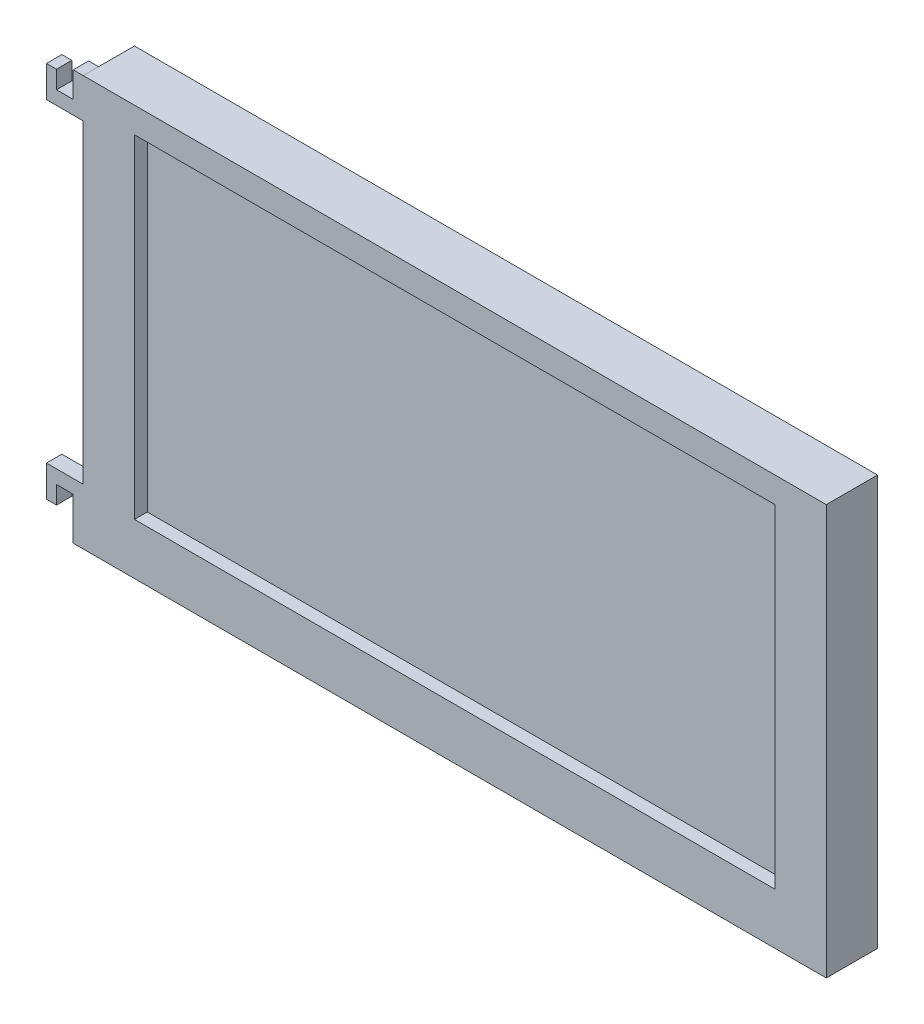
ISO-10303-21;
HEADER;
FILE_DESCRIPTION(('STEP AP214'),'2;1');
FILE_NAME('part.step','',(''),(''),'','','');
FILE_SCHEMA(('AUTOMOTIVE_DESIGN { 1 0 10303 214 1 1 1 1 }'));
ENDSEC;
DATA;
#1=APPLICATION_CONTEXT('core data for automotive mechanical design processes');
#2=APPLICATION_PROTOCOL_DEFINITION('international standard','automotive_design',2000,#1);
#3=PRODUCT_CONTEXT('',#1,'mechanical');
#4=PRODUCT('Part','Part','',(#3));
#5=PRODUCT_RELATED_PRODUCT_CATEGORY('part','',(#4));
#6=PRODUCT_DEFINITION_FORMATION('','',#4);
#7=PRODUCT_DEFINITION_CONTEXT('part definition',#1,'design');
#8=PRODUCT_DEFINITION('design','',#6,#7);
#9=PRODUCT_DEFINITION_SHAPE('','',#8);
#10=(LENGTH_UNIT() NAMED_UNIT(*) SI_UNIT(.MILLI.,.METRE.));
#11=(NAMED_UNIT(*) PLANE_ANGLE_UNIT() SI_UNIT($,.RADIAN.));
#12=(NAMED_UNIT(*) SI_UNIT($,.STERADIAN.) SOLID_ANGLE_UNIT());
#13=UNCERTAINTY_MEASURE_WITH_UNIT(LENGTH_MEASURE(1.E-05),#10,'distance_accuracy_value','');
#14=(GEOMETRIC_REPRESENTATION_CONTEXT(3) GLOBAL_UNCERTAINTY_ASSIGNED_CONTEXT((#13)) GLOBAL_UNIT_ASSIGNED_CONTEXT((#10,
#11,#12)) REPRESENTATION_CONTEXT('',''));
#15=CARTESIAN_POINT('',(0.,0.,0.));
#16=DIRECTION('',(0.,0.,1.));
#17=DIRECTION('',(1.,0.,0.));
#18=AXIS2_PLACEMENT_3D('',#15,#16,#17);
#19=CARTESIAN_POINT('',(0.,0.,12.7));
#20=DIRECTION('',(0.,0.,1.));
#21=DIRECTION('',(1.,0.,0.));
#22=AXIS2_PLACEMENT_3D('',#19,#20,#21);
#23=PLANE('',#22);
#24=DIRECTION('',(1.,0.,0.));
#25=VECTOR('',#24,1.);
#26=CARTESIAN_POINT('',(-184.15,-101.6,12.7));
#27=LINE('',#26,#25);
#28=CARTESIAN_POINT('',(-189.1197006928,-101.6,12.7));
#29=VERTEX_POINT('',#28);
#30=CARTESIAN_POINT('',(184.15,-101.6,12.7));
#31=VERTEX_POINT('',#30);
#32=EDGE_CURVE('E205',#29,#31,#27,.T.);
#33=ORIENTED_EDGE('',*,*,#32,.T.);
#34=DIRECTION('',(0.,1.,0.));
#35=VECTOR('',#34,1.);
#36=CARTESIAN_POINT('',(184.15,101.6,12.7));
#37=LINE('',#36,#35);
#38=CARTESIAN_POINT('',(184.15,101.6,12.7));
#39=VERTEX_POINT('',#38);
#40=EDGE_CURVE('E195',#31,#39,#37,.T.);
#41=ORIENTED_EDGE('',*,*,#40,.T.);
#42=DIRECTION('',(-1.,0.,0.));
#43=VECTOR('',#42,1.);
#44=CARTESIAN_POINT('',(-184.15,101.6,12.7));
#45=LINE('',#44,#43);
#46=CARTESIAN_POINT('',(-184.15,101.6,12.7));
#47=VERTEX_POINT('',#46);
#48=EDGE_CURVE('E204',#39,#47,#45,.T.);
#49=ORIENTED_EDGE('',*,*,#48,.T.);
#50=DIRECTION('',(0.,-1.,0.));
#51=VECTOR('',#50,1.);
#52=CARTESIAN_POINT('',(-184.15,101.6,12.7));
#53=LINE('',#52,#51);
#54=CARTESIAN_POINT('',(-184.15,101.584884773139,12.7));
#55=VERTEX_POINT('',#54);
#56=EDGE_CURVE('E220',#47,#55,#53,.T.);
#57=ORIENTED_EDGE('',*,*,#56,.T.);
#58=DIRECTION('',(1.,0.,0.));
#59=VECTOR('',#58,1.);
#60=CARTESIAN_POINT('',(-184.15,101.584884773139,12.7));
#61=LINE('',#60,#59);
#62=CARTESIAN_POINT('',(-189.1197006928,101.584884773139,12.7));
#63=VERTEX_POINT('',#62);
#64=EDGE_CURVE('E265',#63,#55,#61,.T.);
#65=ORIENTED_EDGE('',*,*,#64,.F.);
#66=DIRECTION('',(0.,1.,0.));
#67=VECTOR('',#66,1.);
#68=CARTESIAN_POINT('',(-189.1197006928,88.9,12.7));
#69=LINE('',#68,#67);
#70=CARTESIAN_POINT('',(-189.1197006928,88.9,12.7));
#71=VERTEX_POINT('',#70);
#72=EDGE_CURVE('E267',#71,#63,#69,.T.);
#73=ORIENTED_EDGE('',*,*,#72,.F.);
#74=DIRECTION('',(1.,0.,0.));
#75=VECTOR('',#74,1.);
#76=CARTESIAN_POINT('',(-189.1197006928,88.9,12.7));
#77=LINE('',#76,#75);
#78=CARTESIAN_POINT('',(-197.392455233142,88.9,12.7));
#79=VERTEX_POINT('',#78);
#80=EDGE_CURVE('E273',#79,#71,#77,.T.);
#81=ORIENTED_EDGE('',*,*,#80,.F.);
#82=DIRECTION('',(0.,-1.,0.));
#83=VECTOR('',#82,1.);
#84=CARTESIAN_POINT('',(-197.392455233142,88.9,12.7));
#85=LINE('',#84,#83);
#86=CARTESIAN_POINT('',(-197.392455233142,97.7096777511746,12.7));
#87=VERTEX_POINT('',#86);
#88=EDGE_CURVE('E281',#87,#79,#85,.T.);
#89=ORIENTED_EDGE('',*,*,#88,.F.);
#90=DIRECTION('',(1.,0.,0.));
#91=VECTOR('',#90,1.);
#92=CARTESIAN_POINT('',(-197.392455233142,97.7096777511746,12.7));
#93=LINE('',#92,#91);
#94=CARTESIAN_POINT('',(-202.362155925942,97.7096777511746,12.7));
#95=VERTEX_POINT('',#94);
#96=EDGE_CURVE('E284',#95,#87,#93,.T.);
#97=ORIENTED_EDGE('',*,*,#96,.F.);
#98=DIRECTION('',(0.,1.,0.));
#99=VECTOR('',#98,1.);
#100=CARTESIAN_POINT('',(-202.362155925942,82.1604398677149,12.7));
#101=LINE('',#100,#99);
#102=CARTESIAN_POINT('',(-202.362155925942,82.1604398677149,12.7));
#103=VERTEX_POINT('',#102);
#104=EDGE_CURVE('E287',#103,#95,#101,.T.);
#105=ORIENTED_EDGE('',*,*,#104,.F.);
#106=DIRECTION('',(-1.,0.,0.));
#107=VECTOR('',#106,1.);
#108=CARTESIAN_POINT('',(-184.15,82.1604398677149,12.7));
#109=LINE('',#108,#107);
#110=CARTESIAN_POINT('',(-184.15,82.1604398677149,12.7));
#111=VERTEX_POINT('',#110);
#112=EDGE_CURVE('E57',#111,#103,#109,.T.);
#113=ORIENTED_EDGE('',*,*,#112,.F.);
#114=CARTESIAN_POINT('',(-184.15,-73.8206556166965,12.7));
#115=VERTEX_POINT('',#114);
#116=EDGE_CURVE('E62',#111,#115,#53,.T.);
#117=ORIENTED_EDGE('',*,*,#116,.T.);
#118=DIRECTION('',(1.,0.,0.));
#119=VECTOR('',#118,1.);
#120=CARTESIAN_POINT('',(-184.15,-73.8206556166965,12.7));
#121=LINE('',#120,#119);
#122=CARTESIAN_POINT('',(-202.362155925942,-73.8206556166965,12.7));
#123=VERTEX_POINT('',#122);
#124=EDGE_CURVE('E296',#123,#115,#121,.T.);
#125=ORIENTED_EDGE('',*,*,#124,.F.);
#126=DIRECTION('',(0.,1.,0.));
#127=VECTOR('',#126,1.);
#128=CARTESIAN_POINT('',(-202.362155925942,-73.8206556166965,12.7));
#129=LINE('',#128,#127);
#130=CARTESIAN_POINT('',(-202.362155925942,-89.3698935001561,12.7));
#131=VERTEX_POINT('',#130);
#132=EDGE_CURVE('E350',#131,#123,#129,.T.);
#133=ORIENTED_EDGE('',*,*,#132,.F.);
#134=DIRECTION('',(-1.,0.,0.));
#135=VECTOR('',#134,1.);
#136=CARTESIAN_POINT('',(-202.362155925942,-89.3698935001561,12.7));
#137=LINE('',#136,#135);
#138=CARTESIAN_POINT('',(-197.392455233142,-89.3698935001561,12.7));
#139=VERTEX_POINT('',#138);
#140=EDGE_CURVE('E353',#139,#131,#137,.T.);
#141=ORIENTED_EDGE('',*,*,#140,.F.);
#142=DIRECTION('',(0.,-1.,0.));
#143=VECTOR('',#142,1.);
#144=CARTESIAN_POINT('',(-197.392455233142,-80.5602157489815,12.7));
#145=LINE('',#144,#143);
#146=CARTESIAN_POINT('',(-197.392455233142,-80.5602157489815,12.7));
#147=VERTEX_POINT('',#146);
#148=EDGE_CURVE('E356',#147,#139,#145,.T.);
#149=ORIENTED_EDGE('',*,*,#148,.F.);
#150=DIRECTION('',(-1.,0.,0.));
#151=VECTOR('',#150,1.);
#152=CARTESIAN_POINT('',(-189.1197006928,-80.5602157489815,12.7));
#153=LINE('',#152,#151);
#154=CARTESIAN_POINT('',(-189.1197006928,-80.5602157489815,12.7));
#155=VERTEX_POINT('',#154);
#156=EDGE_CURVE('E359',#155,#147,#153,.T.);
#157=ORIENTED_EDGE('',*,*,#156,.F.);
#158=DIRECTION('',(0.,1.,0.));
#159=VECTOR('',#158,1.);
#160=CARTESIAN_POINT('',(-189.1197006928,-101.6,12.7));
#161=LINE('',#160,#159);
#162=EDGE_CURVE('E218',#29,#155,#161,.T.);
#163=ORIENTED_EDGE('',*,*,#162,.F.);
#164=EDGE_LOOP('',(#33,#41,#49,#57,#65,#73,#81,#89,#97,#105,#113,#117,#125,#133,#141,#149,#157,#163));
#165=FACE_BOUND('',#164,.T.);
#166=DIRECTION('',(0.,-1.,0.));
#167=VECTOR('',#166,1.);
#168=CARTESIAN_POINT('',(-158.75,88.9,12.7));
#169=LINE('',#168,#167);
#170=CARTESIAN_POINT('',(-158.75,88.9,12.7));
#171=VERTEX_POINT('',#170);
#172=CARTESIAN_POINT('',(-158.75,-76.2,12.7));
#173=VERTEX_POINT('',#172);
#174=EDGE_CURVE('E367',#171,#173,#169,.T.);
#175=ORIENTED_EDGE('',*,*,#174,.F.);
#176=DIRECTION('',(-1.,0.,0.));
#177=VECTOR('',#176,1.);
#178=CARTESIAN_POINT('',(-158.75,88.9,12.7));
#179=LINE('',#178,#177);
#180=CARTESIAN_POINT('',(158.75,88.9,12.7));
#181=VERTEX_POINT('',#180);
#182=EDGE_CURVE('E396',#181,#171,#179,.T.);
#183=ORIENTED_EDGE('',*,*,#182,.F.);
#184=DIRECTION('',(0.,1.,0.));
#185=VECTOR('',#184,1.);
#186=CARTESIAN_POINT('',(158.75,88.9,12.7));
#187=LINE('',#186,#185);
#188=CARTESIAN_POINT('',(158.75,-76.2,12.7));
#189=VERTEX_POINT('',#188);
#190=EDGE_CURVE('E415',#189,#181,#187,.T.);
#191=ORIENTED_EDGE('',*,*,#190,.F.);
#192=DIRECTION('',(1.,0.,0.));
#193=VECTOR('',#192,1.);
#194=CARTESIAN_POINT('',(-158.75,-76.2,12.7));
#195=LINE('',#194,#193);
#196=EDGE_CURVE('E411',#173,#189,#195,.T.);
#197=ORIENTED_EDGE('',*,*,#196,.F.);
#198=EDGE_LOOP('',(#175,#183,#191,#197));
#199=FACE_BOUND('',#198,.T.);
#200=ADVANCED_FACE('F41',(#165,#199),#23,.T.);
#201=CARTESIAN_POINT('',(-184.15,101.6,12.7));
#202=DIRECTION('',(1.,0.,0.));
#203=DIRECTION('',(0.,0.,-1.));
#204=AXIS2_PLACEMENT_3D('',#201,#202,#203);
#205=PLANE('',#204);
#206=DIRECTION('',(0.,0.,1.));
#207=VECTOR('',#206,1.);
#208=CARTESIAN_POINT('',(-184.15,82.1604398677149,5.08));
#209=LINE('',#208,#207);
#210=CARTESIAN_POINT('',(-184.15,82.1604398677149,5.08));
#211=VERTEX_POINT('',#210);
#212=EDGE_CURVE('E293',#211,#111,#209,.T.);
#213=ORIENTED_EDGE('',*,*,#212,.F.);
#214=DIRECTION('',(0.,-1.,0.));
#215=VECTOR('',#214,1.);
#216=CARTESIAN_POINT('',(-184.15,88.0125906923723,5.08));
#217=LINE('',#216,#215);
#218=CARTESIAN_POINT('',(-184.15,101.584884773139,5.08));
#219=VERTEX_POINT('',#218);
#220=EDGE_CURVE('E292',#219,#211,#217,.T.);
#221=ORIENTED_EDGE('',*,*,#220,.F.);
#222=DIRECTION('',(0.,0.,1.));
#223=VECTOR('',#222,1.);
#224=CARTESIAN_POINT('',(-184.15,101.584884773139,5.08));
#225=LINE('',#224,#223);
#226=EDGE_CURVE('E262',#219,#55,#225,.T.);
#227=ORIENTED_EDGE('',*,*,#226,.T.);
#228=ORIENTED_EDGE('',*,*,#56,.F.);
#229=DIRECTION('',(0.,0.,-1.));
#230=VECTOR('',#229,1.);
#231=CARTESIAN_POINT('',(-184.15,101.6,12.7));
#232=LINE('',#231,#230);
#233=CARTESIAN_POINT('',(-184.15,101.6,-12.7));
#234=VERTEX_POINT('',#233);
#235=EDGE_CURVE('E229',#47,#234,#232,.T.);
#236=ORIENTED_EDGE('',*,*,#235,.T.);
#237=DIRECTION('',(0.,-1.,0.));
#238=VECTOR('',#237,1.);
#239=CARTESIAN_POINT('',(-184.15,101.6,-12.7));
#240=LINE('',#239,#238);
#241=CARTESIAN_POINT('',(-184.15,-101.6,-12.7));
#242=VERTEX_POINT('',#241);
#243=EDGE_CURVE('E230',#234,#242,#240,.T.);
#244=ORIENTED_EDGE('',*,*,#243,.T.);
#245=DIRECTION('',(0.,0.,-1.));
#246=VECTOR('',#245,1.);
#247=CARTESIAN_POINT('',(-184.15,-101.6,12.7));
#248=LINE('',#247,#246);
#249=CARTESIAN_POINT('',(-184.15,-101.6,5.08));
#250=VERTEX_POINT('',#249);
#251=EDGE_CURVE('E11',#250,#242,#248,.T.);
#252=ORIENTED_EDGE('',*,*,#251,.F.);
#253=DIRECTION('',(0.,-1.,0.));
#254=VECTOR('',#253,1.);
#255=CARTESIAN_POINT('',(-184.15,-101.6,5.08));
#256=LINE('',#255,#254);
#257=CARTESIAN_POINT('',(-184.15,-73.8206556166965,5.08));
#258=VERTEX_POINT('',#257);
#259=EDGE_CURVE('E322',#258,#250,#256,.T.);
#260=ORIENTED_EDGE('',*,*,#259,.F.);
#261=DIRECTION('',(0.,0.,1.));
#262=VECTOR('',#261,1.);
#263=CARTESIAN_POINT('',(-184.15,-73.8206556166965,5.08));
#264=LINE('',#263,#262);
#265=EDGE_CURVE('E347',#258,#115,#264,.T.);
#266=ORIENTED_EDGE('',*,*,#265,.T.);
#267=ORIENTED_EDGE('',*,*,#116,.F.);
#268=EDGE_LOOP('',(#213,#221,#227,#228,#236,#244,#252,#260,#266,#267));
#269=FACE_BOUND('',#268,.T.);
#270=ADVANCED_FACE('F43',(#269),#205,.F.);
#271=CARTESIAN_POINT('',(184.15,101.6,12.7));
#272=DIRECTION('',(-1.,0.,0.));
#273=DIRECTION('',(0.,0.,1.));
#274=AXIS2_PLACEMENT_3D('',#271,#272,#273);
#275=PLANE('',#274);
#276=DIRECTION('',(0.,0.,-1.));
#277=VECTOR('',#276,1.);
#278=CARTESIAN_POINT('',(184.15,101.6,12.7));
#279=LINE('',#278,#277);
#280=CARTESIAN_POINT('',(184.15,101.6,-12.7));
#281=VERTEX_POINT('',#280);
#282=EDGE_CURVE('E200',#39,#281,#279,.T.);
#283=ORIENTED_EDGE('',*,*,#282,.F.);
#284=ORIENTED_EDGE('',*,*,#40,.F.);
#285=DIRECTION('',(0.,0.,-1.));
#286=VECTOR('',#285,1.);
#287=CARTESIAN_POINT('',(184.15,-101.6,12.7));
#288=LINE('',#287,#286);
#289=CARTESIAN_POINT('',(184.15,-101.6,-12.7));
#290=VERTEX_POINT('',#289);
#291=EDGE_CURVE('E50',#31,#290,#288,.T.);
#292=ORIENTED_EDGE('',*,*,#291,.T.);
#293=DIRECTION('',(0.,1.,0.));
#294=VECTOR('',#293,1.);
#295=CARTESIAN_POINT('',(184.15,101.6,-12.7));
#296=LINE('',#295,#294);
#297=EDGE_CURVE('E237',#290,#281,#296,.T.);
#298=ORIENTED_EDGE('',*,*,#297,.T.);
#299=EDGE_LOOP('',(#283,#284,#292,#298));
#300=FACE_BOUND('',#299,.T.);
#301=ADVANCED_FACE('F197',(#300),#275,.F.);
#302=CARTESIAN_POINT('',(-184.15,-101.6,12.7));
#303=DIRECTION('',(0.,1.,0.));
#304=DIRECTION('',(0.,0.,1.));
#305=AXIS2_PLACEMENT_3D('',#302,#303,#304);
#306=PLANE('',#305);
#307=ORIENTED_EDGE('',*,*,#291,.F.);
#308=ORIENTED_EDGE('',*,*,#32,.F.);
#309=DIRECTION('',(0.,0.,1.));
#310=VECTOR('',#309,1.);
#311=CARTESIAN_POINT('',(-189.1197006928,-101.6,5.08));
#312=LINE('',#311,#310);
#313=CARTESIAN_POINT('',(-189.1197006928,-101.6,5.08));
#314=VERTEX_POINT('',#313);
#315=EDGE_CURVE('E364',#314,#29,#312,.T.);
#316=ORIENTED_EDGE('',*,*,#315,.F.);
#317=DIRECTION('',(-1.,0.,0.));
#318=VECTOR('',#317,1.);
#319=CARTESIAN_POINT('',(-184.15,-101.6,5.08));
#320=LINE('',#319,#318);
#321=EDGE_CURVE('E344',#250,#314,#320,.T.);
#322=ORIENTED_EDGE('',*,*,#321,.F.);
#323=ORIENTED_EDGE('',*,*,#251,.T.);
#324=DIRECTION('',(1.,0.,0.));
#325=VECTOR('',#324,1.);
#326=CARTESIAN_POINT('',(-184.15,-101.6,-12.7));
#327=LINE('',#326,#325);
#328=EDGE_CURVE('E212',#242,#290,#327,.T.);
#329=ORIENTED_EDGE('',*,*,#328,.T.);
#330=EDGE_LOOP('',(#307,#308,#316,#322,#323,#329));
#331=FACE_BOUND('',#330,.T.);
#332=ADVANCED_FACE('F208',(#331),#306,.F.);
#333=CARTESIAN_POINT('',(-184.15,101.6,12.7));
#334=DIRECTION('',(0.,-1.,0.));
#335=DIRECTION('',(0.,0.,-1.));
#336=AXIS2_PLACEMENT_3D('',#333,#334,#335);
#337=PLANE('',#336);
#338=DIRECTION('',(-1.,0.,0.));
#339=VECTOR('',#338,1.);
#340=CARTESIAN_POINT('',(-184.15,101.6,-12.7));
#341=LINE('',#340,#339);
#342=EDGE_CURVE('E240',#281,#234,#341,.T.);
#343=ORIENTED_EDGE('',*,*,#342,.T.);
#344=ORIENTED_EDGE('',*,*,#235,.F.);
#345=ORIENTED_EDGE('',*,*,#48,.F.);
#346=ORIENTED_EDGE('',*,*,#282,.T.);
#347=EDGE_LOOP('',(#343,#344,#345,#346));
#348=FACE_BOUND('',#347,.T.);
#349=ADVANCED_FACE('F249',(#348),#337,.F.);
#350=CARTESIAN_POINT('',(0.,0.,-12.7));
#351=DIRECTION('',(0.,0.,1.));
#352=DIRECTION('',(1.,0.,0.));
#353=AXIS2_PLACEMENT_3D('',#350,#351,#352);
#354=PLANE('',#353);
#355=ORIENTED_EDGE('',*,*,#243,.F.);
#356=ORIENTED_EDGE('',*,*,#342,.F.);
#357=ORIENTED_EDGE('',*,*,#297,.F.);
#358=ORIENTED_EDGE('',*,*,#328,.F.);
#359=EDGE_LOOP('',(#355,#356,#357,#358));
#360=FACE_BOUND('',#359,.T.);
#361=ADVANCED_FACE('F253',(#360),#354,.F.);
#362=CARTESIAN_POINT('',(-158.75,88.9,6.35));
#363=DIRECTION('',(-1.,0.,0.));
#364=DIRECTION('',(0.,-1.,0.));
#365=AXIS2_PLACEMENT_3D('',#362,#363,#364);
#366=PLANE('',#365);
#367=ORIENTED_EDGE('',*,*,#174,.T.);
#368=DIRECTION('',(0.,0.,1.));
#369=VECTOR('',#368,1.);
#370=CARTESIAN_POINT('',(-158.75,-76.2,6.35));
#371=LINE('',#370,#369);
#372=CARTESIAN_POINT('',(-158.75,-76.2,6.35));
#373=VERTEX_POINT('',#372);
#374=EDGE_CURVE('E408',#373,#173,#371,.T.);
#375=ORIENTED_EDGE('',*,*,#374,.F.);
#376=DIRECTION('',(0.,-1.,0.));
#377=VECTOR('',#376,1.);
#378=CARTESIAN_POINT('',(-158.75,88.9,6.35));
#379=LINE('',#378,#377);
#380=CARTESIAN_POINT('',(-158.75,88.9,6.35));
#381=VERTEX_POINT('',#380);
#382=EDGE_CURVE('E391',#381,#373,#379,.T.);
#383=ORIENTED_EDGE('',*,*,#382,.F.);
#384=DIRECTION('',(0.,0.,1.));
#385=VECTOR('',#384,1.);
#386=CARTESIAN_POINT('',(-158.75,88.9,6.35));
#387=LINE('',#386,#385);
#388=EDGE_CURVE('E234',#381,#171,#387,.T.);
#389=ORIENTED_EDGE('',*,*,#388,.T.);
#390=EDGE_LOOP('',(#367,#375,#383,#389));
#391=FACE_BOUND('',#390,.T.);
#392=ADVANCED_FACE('F446',(#391),#366,.F.);
#393=CARTESIAN_POINT('',(-158.75,88.9,6.35));
#394=DIRECTION('',(0.,1.,0.));
#395=DIRECTION('',(0.,0.,1.));
#396=AXIS2_PLACEMENT_3D('',#393,#394,#395);
#397=PLANE('',#396);
#398=ORIENTED_EDGE('',*,*,#182,.T.);
#399=ORIENTED_EDGE('',*,*,#388,.F.);
#400=DIRECTION('',(-1.,0.,0.));
#401=VECTOR('',#400,1.);
#402=CARTESIAN_POINT('',(-158.75,88.9,6.35));
#403=LINE('',#402,#401);
#404=CARTESIAN_POINT('',(158.75,88.9,6.35));
#405=VERTEX_POINT('',#404);
#406=EDGE_CURVE('E404',#405,#381,#403,.T.);
#407=ORIENTED_EDGE('',*,*,#406,.F.);
#408=DIRECTION('',(0.,0.,1.));
#409=VECTOR('',#408,1.);
#410=CARTESIAN_POINT('',(158.75,88.9,6.35));
#411=LINE('',#410,#409);
#412=EDGE_CURVE('E424',#405,#181,#411,.T.);
#413=ORIENTED_EDGE('',*,*,#412,.T.);
#414=EDGE_LOOP('',(#398,#399,#407,#413));
#415=FACE_BOUND('',#414,.T.);
#416=ADVANCED_FACE('F448',(#415),#397,.F.);
#417=CARTESIAN_POINT('',(158.75,88.9,6.35));
#418=DIRECTION('',(1.,0.,0.));
#419=DIRECTION('',(0.,1.,0.));
#420=AXIS2_PLACEMENT_3D('',#417,#418,#419);
#421=PLANE('',#420);
#422=ORIENTED_EDGE('',*,*,#190,.T.);
#423=ORIENTED_EDGE('',*,*,#412,.F.);
#424=DIRECTION('',(0.,1.,0.));
#425=VECTOR('',#424,1.);
#426=CARTESIAN_POINT('',(158.75,88.9,6.35));
#427=LINE('',#426,#425);
#428=CARTESIAN_POINT('',(158.75,-76.2,6.35));
#429=VERTEX_POINT('',#428);
#430=EDGE_CURVE('E400',#429,#405,#427,.T.);
#431=ORIENTED_EDGE('',*,*,#430,.F.);
#432=DIRECTION('',(0.,0.,1.));
#433=VECTOR('',#432,1.);
#434=CARTESIAN_POINT('',(158.75,-76.2,6.35));
#435=LINE('',#434,#433);
#436=EDGE_CURVE('E427',#429,#189,#435,.T.);
#437=ORIENTED_EDGE('',*,*,#436,.T.);
#438=EDGE_LOOP('',(#422,#423,#431,#437));
#439=FACE_BOUND('',#438,.T.);
#440=ADVANCED_FACE('F441',(#439),#421,.F.);
#441=CARTESIAN_POINT('',(-158.75,-76.2,6.35));
#442=DIRECTION('',(0.,-1.,0.));
#443=DIRECTION('',(0.,0.,-1.));
#444=AXIS2_PLACEMENT_3D('',#441,#442,#443);
#445=PLANE('',#444);
#446=ORIENTED_EDGE('',*,*,#196,.T.);
#447=ORIENTED_EDGE('',*,*,#436,.F.);
#448=DIRECTION('',(1.,0.,0.));
#449=VECTOR('',#448,1.);
#450=CARTESIAN_POINT('',(-158.75,-76.2,6.35));
#451=LINE('',#450,#449);
#452=EDGE_CURVE('E395',#373,#429,#451,.T.);
#453=ORIENTED_EDGE('',*,*,#452,.F.);
#454=ORIENTED_EDGE('',*,*,#374,.T.);
#455=EDGE_LOOP('',(#446,#447,#453,#454));
#456=FACE_BOUND('',#455,.T.);
#457=ADVANCED_FACE('F434',(#456),#445,.F.);
#458=CARTESIAN_POINT('',(0.,0.,6.35));
#459=DIRECTION('',(0.,0.,1.));
#460=DIRECTION('',(1.,0.,0.));
#461=AXIS2_PLACEMENT_3D('',#458,#459,#460);
#462=PLANE('',#461);
#463=ORIENTED_EDGE('',*,*,#382,.T.);
#464=ORIENTED_EDGE('',*,*,#452,.T.);
#465=ORIENTED_EDGE('',*,*,#430,.T.);
#466=ORIENTED_EDGE('',*,*,#406,.T.);
#467=EDGE_LOOP('',(#463,#464,#465,#466));
#468=FACE_BOUND('',#467,.T.);
#469=ADVANCED_FACE('F445',(#468),#462,.T.);
#470=CARTESIAN_POINT('',(-189.1197006928,-101.6,5.08));
#471=DIRECTION('',(1.,0.,0.));
#472=DIRECTION('',(0.,0.,-1.));
#473=AXIS2_PLACEMENT_3D('',#470,#471,#472);
#474=PLANE('',#473);
#475=ORIENTED_EDGE('',*,*,#162,.T.);
#476=DIRECTION('',(0.,0.,1.));
#477=VECTOR('',#476,1.);
#478=CARTESIAN_POINT('',(-189.1197006928,-80.5602157489815,5.08));
#479=LINE('',#478,#477);
#480=CARTESIAN_POINT('',(-189.1197006928,-80.5602157489815,5.08));
#481=VERTEX_POINT('',#480);
#482=EDGE_CURVE('E368',#481,#155,#479,.T.);
#483=ORIENTED_EDGE('',*,*,#482,.F.);
#484=DIRECTION('',(0.,1.,0.));
#485=VECTOR('',#484,1.);
#486=CARTESIAN_POINT('',(-189.1197006928,-101.6,5.08));
#487=LINE('',#486,#485);
#488=EDGE_CURVE('E341',#314,#481,#487,.T.);
#489=ORIENTED_EDGE('',*,*,#488,.F.);
#490=ORIENTED_EDGE('',*,*,#315,.T.);
#491=EDGE_LOOP('',(#475,#483,#489,#490));
#492=FACE_BOUND('',#491,.T.);
#493=ADVANCED_FACE('F513',(#492),#474,.F.);
#494=CARTESIAN_POINT('',(-189.1197006928,-80.5602157489815,5.08));
#495=DIRECTION('',(0.,1.,0.));
#496=DIRECTION('',(0.,0.,1.));
#497=AXIS2_PLACEMENT_3D('',#494,#495,#496);
#498=PLANE('',#497);
#499=ORIENTED_EDGE('',*,*,#156,.T.);
#500=DIRECTION('',(0.,0.,1.));
#501=VECTOR('',#500,1.);
#502=CARTESIAN_POINT('',(-197.392455233142,-80.5602157489815,5.08));
#503=LINE('',#502,#501);
#504=CARTESIAN_POINT('',(-197.392455233142,-80.5602157489815,5.08));
#505=VERTEX_POINT('',#504);
#506=EDGE_CURVE('E372',#505,#147,#503,.T.);
#507=ORIENTED_EDGE('',*,*,#506,.F.);
#508=DIRECTION('',(-1.,0.,0.));
#509=VECTOR('',#508,1.);
#510=CARTESIAN_POINT('',(-189.1197006928,-80.5602157489815,5.08));
#511=LINE('',#510,#509);
#512=EDGE_CURVE('E338',#481,#505,#511,.T.);
#513=ORIENTED_EDGE('',*,*,#512,.F.);
#514=ORIENTED_EDGE('',*,*,#482,.T.);
#515=EDGE_LOOP('',(#499,#507,#513,#514));
#516=FACE_BOUND('',#515,.T.);
#517=ADVANCED_FACE('F529',(#516),#498,.F.);
#518=CARTESIAN_POINT('',(-197.392455233142,-80.5602157489815,5.08));
#519=DIRECTION('',(-1.,0.,0.));
#520=DIRECTION('',(0.,0.,1.));
#521=AXIS2_PLACEMENT_3D('',#518,#519,#520);
#522=PLANE('',#521);
#523=ORIENTED_EDGE('',*,*,#148,.T.);
#524=DIRECTION('',(0.,0.,1.));
#525=VECTOR('',#524,1.);
#526=CARTESIAN_POINT('',(-197.392455233142,-89.3698935001561,5.08));
#527=LINE('',#526,#525);
#528=CARTESIAN_POINT('',(-197.392455233142,-89.3698935001561,5.08));
#529=VERTEX_POINT('',#528);
#530=EDGE_CURVE('E376',#529,#139,#527,.T.);
#531=ORIENTED_EDGE('',*,*,#530,.F.);
#532=DIRECTION('',(0.,-1.,0.));
#533=VECTOR('',#532,1.);
#534=CARTESIAN_POINT('',(-197.392455233142,-80.5602157489815,5.08));
#535=LINE('',#534,#533);
#536=EDGE_CURVE('E335',#505,#529,#535,.T.);
#537=ORIENTED_EDGE('',*,*,#536,.F.);
#538=ORIENTED_EDGE('',*,*,#506,.T.);
#539=EDGE_LOOP('',(#523,#531,#537,#538));
#540=FACE_BOUND('',#539,.T.);
#541=ADVANCED_FACE('F539',(#540),#522,.F.);
#542=CARTESIAN_POINT('',(-202.362155925942,-89.3698935001561,5.08));
#543=DIRECTION('',(0.,1.,0.));
#544=DIRECTION('',(0.,0.,1.));
#545=AXIS2_PLACEMENT_3D('',#542,#543,#544);
#546=PLANE('',#545);
#547=ORIENTED_EDGE('',*,*,#140,.T.);
#548=DIRECTION('',(0.,0.,1.));
#549=VECTOR('',#548,1.);
#550=CARTESIAN_POINT('',(-202.362155925942,-89.3698935001561,5.08));
#551=LINE('',#550,#549);
#552=CARTESIAN_POINT('',(-202.362155925942,-89.3698935001561,5.08));
#553=VERTEX_POINT('',#552);
#554=EDGE_CURVE('E380',#553,#131,#551,.T.);
#555=ORIENTED_EDGE('',*,*,#554,.F.);
#556=DIRECTION('',(-1.,0.,0.));
#557=VECTOR('',#556,1.);
#558=CARTESIAN_POINT('',(-202.362155925942,-89.3698935001561,5.08));
#559=LINE('',#558,#557);
#560=EDGE_CURVE('E332',#529,#553,#559,.T.);
#561=ORIENTED_EDGE('',*,*,#560,.F.);
#562=ORIENTED_EDGE('',*,*,#530,.T.);
#563=EDGE_LOOP('',(#547,#555,#561,#562));
#564=FACE_BOUND('',#563,.T.);
#565=ADVANCED_FACE('F549',(#564),#546,.F.);
#566=CARTESIAN_POINT('',(-202.362155925942,-73.8206556166965,5.08));
#567=DIRECTION('',(1.,0.,0.));
#568=DIRECTION('',(0.,0.,-1.));
#569=AXIS2_PLACEMENT_3D('',#566,#567,#568);
#570=PLANE('',#569);
#571=ORIENTED_EDGE('',*,*,#132,.T.);
#572=DIRECTION('',(0.,0.,1.));
#573=VECTOR('',#572,1.);
#574=CARTESIAN_POINT('',(-202.362155925942,-73.8206556166965,5.08));
#575=LINE('',#574,#573);
#576=CARTESIAN_POINT('',(-202.362155925942,-73.8206556166965,5.08));
#577=VERTEX_POINT('',#576);
#578=EDGE_CURVE('E384',#577,#123,#575,.T.);
#579=ORIENTED_EDGE('',*,*,#578,.F.);
#580=DIRECTION('',(0.,1.,0.));
#581=VECTOR('',#580,1.);
#582=CARTESIAN_POINT('',(-202.362155925942,-73.8206556166965,5.08));
#583=LINE('',#582,#581);
#584=EDGE_CURVE('E329',#553,#577,#583,.T.);
#585=ORIENTED_EDGE('',*,*,#584,.F.);
#586=ORIENTED_EDGE('',*,*,#554,.T.);
#587=EDGE_LOOP('',(#571,#579,#585,#586));
#588=FACE_BOUND('',#587,.T.);
#589=ADVANCED_FACE('F559',(#588),#570,.F.);
#590=CARTESIAN_POINT('',(-184.15,-73.8206556166965,5.08));
#591=DIRECTION('',(0.,-1.,0.));
#592=DIRECTION('',(0.,0.,-1.));
#593=AXIS2_PLACEMENT_3D('',#590,#591,#592);
#594=PLANE('',#593);
#595=ORIENTED_EDGE('',*,*,#124,.T.);
#596=ORIENTED_EDGE('',*,*,#265,.F.);
#597=DIRECTION('',(1.,0.,0.));
#598=VECTOR('',#597,1.);
#599=CARTESIAN_POINT('',(-184.15,-73.8206556166965,5.08));
#600=LINE('',#599,#598);
#601=EDGE_CURVE('E326',#577,#258,#600,.T.);
#602=ORIENTED_EDGE('',*,*,#601,.F.);
#603=ORIENTED_EDGE('',*,*,#578,.T.);
#604=EDGE_LOOP('',(#595,#596,#602,#603));
#605=FACE_BOUND('',#604,.T.);
#606=ADVANCED_FACE('F569',(#605),#594,.F.);
#607=CARTESIAN_POINT('',(0.,0.,5.08));
#608=DIRECTION('',(0.,0.,-1.));
#609=DIRECTION('',(1.,0.,0.));
#610=AXIS2_PLACEMENT_3D('',#607,#608,#609);
#611=PLANE('',#610);
#612=ORIENTED_EDGE('',*,*,#259,.T.);
#613=ORIENTED_EDGE('',*,*,#321,.T.);
#614=ORIENTED_EDGE('',*,*,#488,.T.);
#615=ORIENTED_EDGE('',*,*,#512,.T.);
#616=ORIENTED_EDGE('',*,*,#536,.T.);
#617=ORIENTED_EDGE('',*,*,#560,.T.);
#618=ORIENTED_EDGE('',*,*,#584,.T.);
#619=ORIENTED_EDGE('',*,*,#601,.T.);
#620=EDGE_LOOP('',(#612,#613,#614,#615,#616,#617,#618,#619));
#621=FACE_BOUND('',#620,.T.);
#622=ADVANCED_FACE('F579',(#621),#611,.T.);
#623=CARTESIAN_POINT('',(-184.15,82.1604398677149,5.08));
#624=DIRECTION('',(0.,1.,0.));
#625=DIRECTION('',(0.,0.,1.));
#626=AXIS2_PLACEMENT_3D('',#623,#624,#625);
#627=PLANE('',#626);
#628=ORIENTED_EDGE('',*,*,#112,.T.);
#629=DIRECTION('',(0.,0.,1.));
#630=VECTOR('',#629,1.);
#631=CARTESIAN_POINT('',(-202.362155925942,82.1604398677149,5.08));
#632=LINE('',#631,#630);
#633=CARTESIAN_POINT('',(-202.362155925942,82.1604398677149,5.08));
#634=VERTEX_POINT('',#633);
#635=EDGE_CURVE('E297',#634,#103,#632,.T.);
#636=ORIENTED_EDGE('',*,*,#635,.F.);
#637=DIRECTION('',(-1.,0.,0.));
#638=VECTOR('',#637,1.);
#639=CARTESIAN_POINT('',(-184.15,82.1604398677149,5.08));
#640=LINE('',#639,#638);
#641=EDGE_CURVE('E276',#211,#634,#640,.T.);
#642=ORIENTED_EDGE('',*,*,#641,.F.);
#643=ORIENTED_EDGE('',*,*,#212,.T.);
#644=EDGE_LOOP('',(#628,#636,#642,#643));
#645=FACE_BOUND('',#644,.T.);
#646=ADVANCED_FACE('F589',(#645),#627,.F.);
#647=CARTESIAN_POINT('',(-202.362155925942,82.1604398677149,5.08));
#648=DIRECTION('',(1.,0.,0.));
#649=DIRECTION('',(0.,0.,-1.));
#650=AXIS2_PLACEMENT_3D('',#647,#648,#649);
#651=PLANE('',#650);
#652=ORIENTED_EDGE('',*,*,#104,.T.);
#653=DIRECTION('',(0.,0.,1.));
#654=VECTOR('',#653,1.);
#655=CARTESIAN_POINT('',(-202.362155925942,97.7096777511746,5.08));
#656=LINE('',#655,#654);
#657=CARTESIAN_POINT('',(-202.362155925942,97.7096777511746,5.08));
#658=VERTEX_POINT('',#657);
#659=EDGE_CURVE('E301',#658,#95,#656,.T.);
#660=ORIENTED_EDGE('',*,*,#659,.F.);
#661=DIRECTION('',(0.,1.,0.));
#662=VECTOR('',#661,1.);
#663=CARTESIAN_POINT('',(-202.362155925942,82.1604398677149,5.08));
#664=LINE('',#663,#662);
#665=EDGE_CURVE('E713',#634,#658,#664,.T.);
#666=ORIENTED_EDGE('',*,*,#665,.F.);
#667=ORIENTED_EDGE('',*,*,#635,.T.);
#668=EDGE_LOOP('',(#652,#660,#666,#667));
#669=FACE_BOUND('',#668,.T.);
#670=ADVANCED_FACE('F599',(#669),#651,.F.);
#671=CARTESIAN_POINT('',(-197.392455233142,97.7096777511746,5.08));
#672=DIRECTION('',(0.,-1.,0.));
#673=DIRECTION('',(0.,0.,-1.));
#674=AXIS2_PLACEMENT_3D('',#671,#672,#673);
#675=PLANE('',#674);
#676=ORIENTED_EDGE('',*,*,#96,.T.);
#677=DIRECTION('',(0.,0.,1.));
#678=VECTOR('',#677,1.);
#679=CARTESIAN_POINT('',(-197.392455233142,97.7096777511746,5.08));
#680=LINE('',#679,#678);
#681=CARTESIAN_POINT('',(-197.392455233142,97.7096777511746,5.08));
#682=VERTEX_POINT('',#681);
#683=EDGE_CURVE('E305',#682,#87,#680,.T.);
#684=ORIENTED_EDGE('',*,*,#683,.F.);
#685=DIRECTION('',(1.,0.,0.));
#686=VECTOR('',#685,1.);
#687=CARTESIAN_POINT('',(-197.392455233142,97.7096777511746,5.08));
#688=LINE('',#687,#686);
#689=EDGE_CURVE('E731',#658,#682,#688,.T.);
#690=ORIENTED_EDGE('',*,*,#689,.F.);
#691=ORIENTED_EDGE('',*,*,#659,.T.);
#692=EDGE_LOOP('',(#676,#684,#690,#691));
#693=FACE_BOUND('',#692,.T.);
#694=ADVANCED_FACE('F609',(#693),#675,.F.);
#695=CARTESIAN_POINT('',(-197.392455233142,88.9,5.08));
#696=DIRECTION('',(-1.,0.,0.));
#697=DIRECTION('',(0.,0.,1.));
#698=AXIS2_PLACEMENT_3D('',#695,#696,#697);
#699=PLANE('',#698);
#700=ORIENTED_EDGE('',*,*,#88,.T.);
#701=DIRECTION('',(0.,0.,1.));
#702=VECTOR('',#701,1.);
#703=CARTESIAN_POINT('',(-197.392455233142,88.9,5.08));
#704=LINE('',#703,#702);
#705=CARTESIAN_POINT('',(-197.392455233142,88.9,5.08));
#706=VERTEX_POINT('',#705);
#707=EDGE_CURVE('E309',#706,#79,#704,.T.);
#708=ORIENTED_EDGE('',*,*,#707,.F.);
#709=DIRECTION('',(0.,-1.,0.));
#710=VECTOR('',#709,1.);
#711=CARTESIAN_POINT('',(-197.392455233142,88.9,5.08));
#712=LINE('',#711,#710);
#713=EDGE_CURVE('E734',#682,#706,#712,.T.);
#714=ORIENTED_EDGE('',*,*,#713,.F.);
#715=ORIENTED_EDGE('',*,*,#683,.T.);
#716=EDGE_LOOP('',(#700,#708,#714,#715));
#717=FACE_BOUND('',#716,.T.);
#718=ADVANCED_FACE('F619',(#717),#699,.F.);
#719=CARTESIAN_POINT('',(-189.1197006928,88.9,5.08));
#720=DIRECTION('',(0.,-1.,0.));
#721=DIRECTION('',(0.,0.,-1.));
#722=AXIS2_PLACEMENT_3D('',#719,#720,#721);
#723=PLANE('',#722);
#724=ORIENTED_EDGE('',*,*,#80,.T.);
#725=DIRECTION('',(0.,0.,1.));
#726=VECTOR('',#725,1.);
#727=CARTESIAN_POINT('',(-189.1197006928,88.9,5.08));
#728=LINE('',#727,#726);
#729=CARTESIAN_POINT('',(-189.1197006928,88.9,5.08));
#730=VERTEX_POINT('',#729);
#731=EDGE_CURVE('E313',#730,#71,#728,.T.);
#732=ORIENTED_EDGE('',*,*,#731,.F.);
#733=DIRECTION('',(1.,0.,0.));
#734=VECTOR('',#733,1.);
#735=CARTESIAN_POINT('',(-189.1197006928,88.9,5.08));
#736=LINE('',#735,#734);
#737=EDGE_CURVE('E739',#706,#730,#736,.T.);
#738=ORIENTED_EDGE('',*,*,#737,.F.);
#739=ORIENTED_EDGE('',*,*,#707,.T.);
#740=EDGE_LOOP('',(#724,#732,#738,#739));
#741=FACE_BOUND('',#740,.T.);
#742=ADVANCED_FACE('F629',(#741),#723,.F.);
#743=CARTESIAN_POINT('',(-189.1197006928,88.9,5.08));
#744=DIRECTION('',(1.,0.,0.));
#745=DIRECTION('',(0.,0.,-1.));
#746=AXIS2_PLACEMENT_3D('',#743,#744,#745);
#747=PLANE('',#746);
#748=ORIENTED_EDGE('',*,*,#72,.T.);
#749=DIRECTION('',(0.,0.,1.));
#750=VECTOR('',#749,1.);
#751=CARTESIAN_POINT('',(-189.1197006928,101.584884773139,5.08));
#752=LINE('',#751,#750);
#753=CARTESIAN_POINT('',(-189.1197006928,101.584884773139,5.08));
#754=VERTEX_POINT('',#753);
#755=EDGE_CURVE('E317',#754,#63,#752,.T.);
#756=ORIENTED_EDGE('',*,*,#755,.F.);
#757=DIRECTION('',(0.,1.,0.));
#758=VECTOR('',#757,1.);
#759=CARTESIAN_POINT('',(-189.1197006928,88.9,5.08));
#760=LINE('',#759,#758);
#761=EDGE_CURVE('E742',#730,#754,#760,.T.);
#762=ORIENTED_EDGE('',*,*,#761,.F.);
#763=ORIENTED_EDGE('',*,*,#731,.T.);
#764=EDGE_LOOP('',(#748,#756,#762,#763));
#765=FACE_BOUND('',#764,.T.);
#766=ADVANCED_FACE('F639',(#765),#747,.F.);
#767=CARTESIAN_POINT('',(-184.15,101.584884773139,5.08));
#768=DIRECTION('',(0.,-1.,0.));
#769=DIRECTION('',(0.,0.,-1.));
#770=AXIS2_PLACEMENT_3D('',#767,#768,#769);
#771=PLANE('',#770);
#772=ORIENTED_EDGE('',*,*,#64,.T.);
#773=ORIENTED_EDGE('',*,*,#226,.F.);
#774=DIRECTION('',(1.,0.,0.));
#775=VECTOR('',#774,1.);
#776=CARTESIAN_POINT('',(-184.15,101.584884773139,5.08));
#777=LINE('',#776,#775);
#778=EDGE_CURVE('E708',#754,#219,#777,.T.);
#779=ORIENTED_EDGE('',*,*,#778,.F.);
#780=ORIENTED_EDGE('',*,*,#755,.T.);
#781=EDGE_LOOP('',(#772,#773,#779,#780));
#782=FACE_BOUND('',#781,.T.);
#783=ADVANCED_FACE('F649',(#782),#771,.F.);
#784=CARTESIAN_POINT('',(0.,0.,5.08));
#785=DIRECTION('',(0.,0.,-1.));
#786=DIRECTION('',(1.,0.,0.));
#787=AXIS2_PLACEMENT_3D('',#784,#785,#786);
#788=PLANE('',#787);
#789=ORIENTED_EDGE('',*,*,#220,.T.);
#790=ORIENTED_EDGE('',*,*,#641,.T.);
#791=ORIENTED_EDGE('',*,*,#665,.T.);
#792=ORIENTED_EDGE('',*,*,#689,.T.);
#793=ORIENTED_EDGE('',*,*,#713,.T.);
#794=ORIENTED_EDGE('',*,*,#737,.T.);
#795=ORIENTED_EDGE('',*,*,#761,.T.);
#796=ORIENTED_EDGE('',*,*,#778,.T.);
#797=EDGE_LOOP('',(#789,#790,#791,#792,#793,#794,#795,#796));
#798=FACE_BOUND('',#797,.T.);
#799=ADVANCED_FACE('F659',(#798),#788,.T.);
#800=CLOSED_SHELL('',(#200,#270,#301,#332,#349,#361,#392,#416,#440,#457,#469,#493,#517,#541,
#565,#589,#606,#622,#646,#670,#694,#718,#742,#766,#783,#799));
#801=MANIFOLD_SOLID_BREP('B2',#800);
#802=ADVANCED_BREP_SHAPE_REPRESENTATION('',(#18,#801),#14);
#803=SHAPE_DEFINITION_REPRESENTATION(#9,#802);
ENDSEC;
END-ISO-10303-21;
